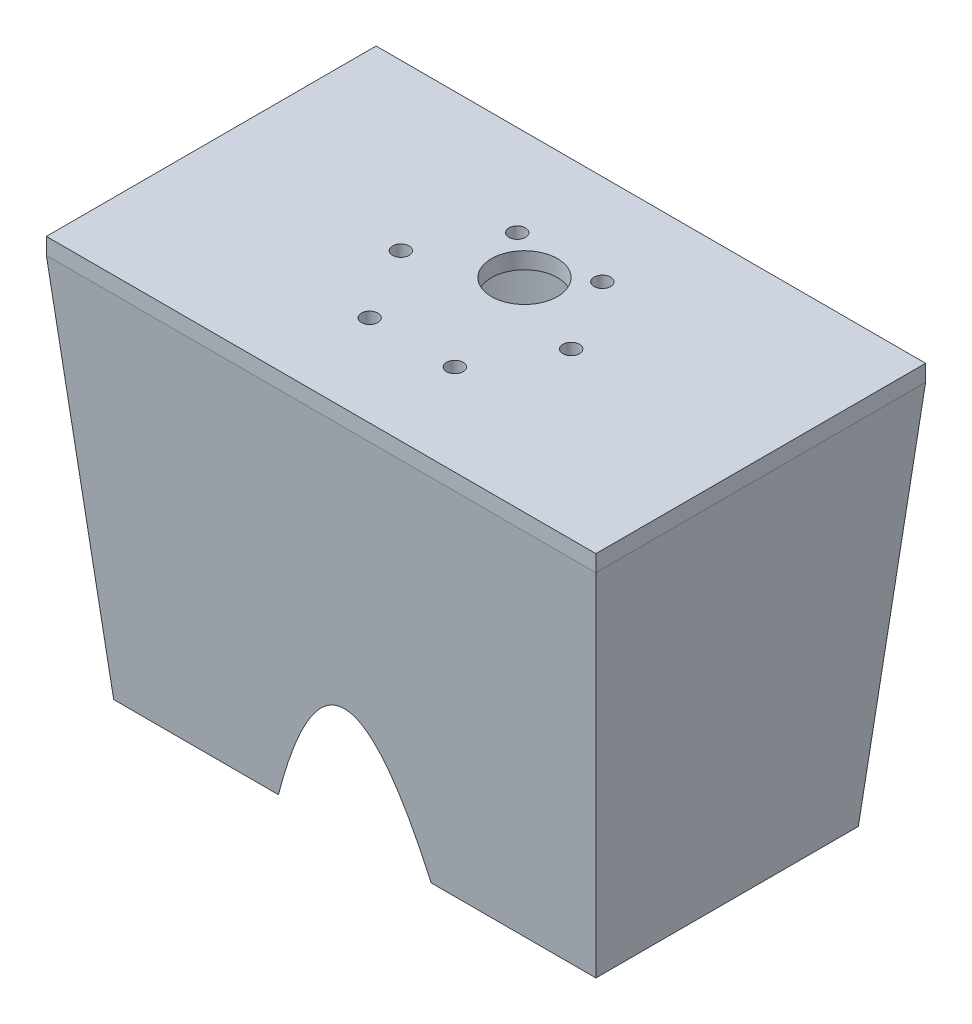
ISO-10303-21;
HEADER;
FILE_DESCRIPTION(('STEP AP214'),'2;1');
FILE_NAME('part.step','',(''),(''),'','','');
FILE_SCHEMA(('AUTOMOTIVE_DESIGN { 1 0 10303 214 1 1 1 1 }'));
ENDSEC;
DATA;
#1=APPLICATION_CONTEXT('core data for automotive mechanical design processes');
#2=APPLICATION_PROTOCOL_DEFINITION('international standard','automotive_design',2000,#1);
#3=PRODUCT_CONTEXT('',#1,'mechanical');
#4=PRODUCT('Part','Part','',(#3));
#5=PRODUCT_RELATED_PRODUCT_CATEGORY('part','',(#4));
#6=PRODUCT_DEFINITION_FORMATION('','',#4);
#7=PRODUCT_DEFINITION_CONTEXT('part definition',#1,'design');
#8=PRODUCT_DEFINITION('design','',#6,#7);
#9=PRODUCT_DEFINITION_SHAPE('','',#8);
#10=(LENGTH_UNIT() NAMED_UNIT(*) SI_UNIT(.MILLI.,.METRE.));
#11=(NAMED_UNIT(*) PLANE_ANGLE_UNIT() SI_UNIT($,.RADIAN.));
#12=(NAMED_UNIT(*) SI_UNIT($,.STERADIAN.) SOLID_ANGLE_UNIT());
#13=UNCERTAINTY_MEASURE_WITH_UNIT(LENGTH_MEASURE(1.E-05),#10,'distance_accuracy_value','');
#14=(GEOMETRIC_REPRESENTATION_CONTEXT(3) GLOBAL_UNCERTAINTY_ASSIGNED_CONTEXT((#13)) GLOBAL_UNIT_ASSIGNED_CONTEXT((#10,
#11,#12)) REPRESENTATION_CONTEXT('',''));
#15=CARTESIAN_POINT('',(0.,0.,0.));
#16=DIRECTION('',(0.,0.,1.));
#17=DIRECTION('',(1.,0.,0.));
#18=AXIS2_PLACEMENT_3D('',#15,#16,#17);
#19=CARTESIAN_POINT('',(0.,0.,0.));
#20=DIRECTION('',(0.,-1.,0.));
#21=DIRECTION('',(0.,0.,-1.));
#22=AXIS2_PLACEMENT_3D('',#19,#20,#21);
#23=PLANE('',#22);
#24=CARTESIAN_POINT('',(7.75000000000016,0.,-13.4233937586587));
#25=DIRECTION('',(0.,1.,0.));
#26=DIRECTION('',(0.,0.,1.));
#27=AXIS2_PLACEMENT_3D('',#24,#25,#26);
#28=CIRCLE('',#27,1.5);
#29=CARTESIAN_POINT('',(7.75000000000016,0.,-11.9233937586587));
#30=VERTEX_POINT('',#29);
#31=EDGE_CURVE('E179',#30,#30,#28,.T.);
#32=ORIENTED_EDGE('',*,*,#31,.T.);
#33=EDGE_LOOP('',(#32));
#34=FACE_BOUND('',#33,.T.);
#35=CARTESIAN_POINT('',(-15.5,0.,-1.08235921504137E-13));
#36=DIRECTION('',(0.,1.,0.));
#37=DIRECTION('',(0.,0.,1.));
#38=AXIS2_PLACEMENT_3D('',#35,#36,#37);
#39=CIRCLE('',#38,1.5);
#40=CARTESIAN_POINT('',(-15.5,0.,1.49999999999989));
#41=VERTEX_POINT('',#40);
#42=EDGE_CURVE('E167',#41,#41,#39,.T.);
#43=ORIENTED_EDGE('',*,*,#42,.T.);
#44=EDGE_LOOP('',(#43));
#45=FACE_BOUND('',#44,.T.);
#46=CARTESIAN_POINT('',(7.74999999999997,0.,13.4233937586588));
#47=DIRECTION('',(0.,1.,0.));
#48=DIRECTION('',(0.,0.,1.));
#49=AXIS2_PLACEMENT_3D('',#46,#47,#48);
#50=CIRCLE('',#49,1.5);
#51=CARTESIAN_POINT('',(7.74999999999997,0.,14.9233937586588));
#52=VERTEX_POINT('',#51);
#53=EDGE_CURVE('E155',#52,#52,#50,.T.);
#54=ORIENTED_EDGE('',*,*,#53,.T.);
#55=EDGE_LOOP('',(#54));
#56=FACE_BOUND('',#55,.T.);
#57=CARTESIAN_POINT('',(0.,0.,-7.));
#58=DIRECTION('',(0.,1.,0.));
#59=DIRECTION('',(0.,0.,1.));
#60=AXIS2_PLACEMENT_3D('',#57,#58,#59);
#61=CIRCLE('',#60,6.);
#62=CARTESIAN_POINT('',(0.,0.,-0.999999999999999));
#63=VERTEX_POINT('',#62);
#64=EDGE_CURVE('E143',#63,#63,#61,.T.);
#65=ORIENTED_EDGE('',*,*,#64,.T.);
#66=EDGE_LOOP('',(#65));
#67=FACE_BOUND('',#66,.T.);
#68=CARTESIAN_POINT('',(15.5,0.,0.));
#69=DIRECTION('',(0.,1.,0.));
#70=DIRECTION('',(0.,0.,1.));
#71=AXIS2_PLACEMENT_3D('',#68,#69,#70);
#72=CIRCLE('',#71,1.5);
#73=CARTESIAN_POINT('',(15.5,0.,1.5));
#74=VERTEX_POINT('',#73);
#75=EDGE_CURVE('E149',#74,#74,#72,.T.);
#76=ORIENTED_EDGE('',*,*,#75,.T.);
#77=EDGE_LOOP('',(#76));
#78=FACE_BOUND('',#77,.T.);
#79=CARTESIAN_POINT('',(-7.75000000000006,0.,13.4233937586588));
#80=DIRECTION('',(0.,1.,0.));
#81=DIRECTION('',(0.,0.,1.));
#82=AXIS2_PLACEMENT_3D('',#79,#80,#81);
#83=CIRCLE('',#82,1.5);
#84=CARTESIAN_POINT('',(-7.75000000000006,0.,14.9233937586588));
#85=VERTEX_POINT('',#84);
#86=EDGE_CURVE('E161',#85,#85,#83,.T.);
#87=ORIENTED_EDGE('',*,*,#86,.T.);
#88=EDGE_LOOP('',(#87));
#89=FACE_BOUND('',#88,.T.);
#90=CARTESIAN_POINT('',(-7.74999999999987,0.,-13.4233937586589));
#91=DIRECTION('',(0.,1.,0.));
#92=DIRECTION('',(0.,0.,1.));
#93=AXIS2_PLACEMENT_3D('',#90,#91,#92);
#94=CIRCLE('',#93,1.5);
#95=CARTESIAN_POINT('',(-7.74999999999987,0.,-11.9233937586589));
#96=VERTEX_POINT('',#95);
#97=EDGE_CURVE('E173',#96,#96,#94,.T.);
#98=ORIENTED_EDGE('',*,*,#97,.T.);
#99=EDGE_LOOP('',(#98));
#100=FACE_BOUND('',#99,.T.);
#101=CARTESIAN_POINT('',(0.,0.,0.));
#102=DIRECTION('',(0.,1.,0.));
#103=DIRECTION('',(0.,0.,1.));
#104=AXIS2_PLACEMENT_3D('',#101,#102,#103);
#105=CIRCLE('',#104,18.5);
#106=CARTESIAN_POINT('',(0.,0.,18.5));
#107=VERTEX_POINT('',#106);
#108=EDGE_CURVE('E188',#107,#107,#105,.T.);
#109=ORIENTED_EDGE('',*,*,#108,.F.);
#110=EDGE_LOOP('',(#109));
#111=FACE_BOUND('',#110,.T.);
#112=ADVANCED_FACE('F33',(#34,#45,#56,#67,#78,#89,#100,#111),#23,.T.);
#113=CARTESIAN_POINT('',(0.,3.,0.));
#114=DIRECTION('',(0.,-1.,0.));
#115=DIRECTION('',(0.,0.,-1.));
#116=AXIS2_PLACEMENT_3D('',#113,#114,#115);
#117=PLANE('',#116);
#118=DIRECTION('',(0.,0.,-1.));
#119=VECTOR('',#118,1.);
#120=CARTESIAN_POINT('',(50.,3.,30.));
#121=LINE('',#120,#119);
#122=CARTESIAN_POINT('',(50.,3.,30.));
#123=VERTEX_POINT('',#122);
#124=CARTESIAN_POINT('',(50.,3.,-30.));
#125=VERTEX_POINT('',#124);
#126=EDGE_CURVE('E106',#123,#125,#121,.T.);
#127=ORIENTED_EDGE('',*,*,#126,.T.);
#128=DIRECTION('',(-1.,0.,0.));
#129=VECTOR('',#128,1.);
#130=CARTESIAN_POINT('',(-50.,3.,-30.));
#131=LINE('',#130,#129);
#132=CARTESIAN_POINT('',(-50.,3.,-30.));
#133=VERTEX_POINT('',#132);
#134=EDGE_CURVE('E140',#125,#133,#131,.T.);
#135=ORIENTED_EDGE('',*,*,#134,.T.);
#136=DIRECTION('',(0.,0.,1.));
#137=VECTOR('',#136,1.);
#138=CARTESIAN_POINT('',(-50.,3.,30.));
#139=LINE('',#138,#137);
#140=CARTESIAN_POINT('',(-50.,3.,30.));
#141=VERTEX_POINT('',#140);
#142=EDGE_CURVE('E138',#133,#141,#139,.T.);
#143=ORIENTED_EDGE('',*,*,#142,.T.);
#144=DIRECTION('',(1.,0.,0.));
#145=VECTOR('',#144,1.);
#146=CARTESIAN_POINT('',(-50.,3.,30.));
#147=LINE('',#146,#145);
#148=EDGE_CURVE('E49',#141,#123,#147,.T.);
#149=ORIENTED_EDGE('',*,*,#148,.T.);
#150=EDGE_LOOP('',(#127,#135,#143,#149));
#151=FACE_BOUND('',#150,.T.);
#152=CARTESIAN_POINT('',(0.,3.,-7.));
#153=DIRECTION('',(0.,1.,0.));
#154=DIRECTION('',(0.,0.,1.));
#155=AXIS2_PLACEMENT_3D('',#152,#153,#154);
#156=CIRCLE('',#155,6.);
#157=CARTESIAN_POINT('',(0.,3.,-0.999999999999999));
#158=VERTEX_POINT('',#157);
#159=EDGE_CURVE('E136',#158,#158,#156,.T.);
#160=ORIENTED_EDGE('',*,*,#159,.F.);
#161=EDGE_LOOP('',(#160));
#162=FACE_BOUND('',#161,.T.);
#163=CARTESIAN_POINT('',(15.5,3.,0.));
#164=DIRECTION('',(0.,1.,0.));
#165=DIRECTION('',(0.,0.,1.));
#166=AXIS2_PLACEMENT_3D('',#163,#164,#165);
#167=CIRCLE('',#166,1.5);
#168=CARTESIAN_POINT('',(15.5,3.,1.5));
#169=VERTEX_POINT('',#168);
#170=EDGE_CURVE('E146',#169,#169,#167,.T.);
#171=ORIENTED_EDGE('',*,*,#170,.F.);
#172=EDGE_LOOP('',(#171));
#173=FACE_BOUND('',#172,.T.);
#174=CARTESIAN_POINT('',(7.74999999999997,3.,13.4233937586588));
#175=DIRECTION('',(0.,1.,0.));
#176=DIRECTION('',(0.,0.,1.));
#177=AXIS2_PLACEMENT_3D('',#174,#175,#176);
#178=CIRCLE('',#177,1.5);
#179=CARTESIAN_POINT('',(7.74999999999997,3.,14.9233937586588));
#180=VERTEX_POINT('',#179);
#181=EDGE_CURVE('E152',#180,#180,#178,.T.);
#182=ORIENTED_EDGE('',*,*,#181,.F.);
#183=EDGE_LOOP('',(#182));
#184=FACE_BOUND('',#183,.T.);
#185=CARTESIAN_POINT('',(-7.75000000000006,3.,13.4233937586588));
#186=DIRECTION('',(0.,1.,0.));
#187=DIRECTION('',(0.,0.,1.));
#188=AXIS2_PLACEMENT_3D('',#185,#186,#187);
#189=CIRCLE('',#188,1.5);
#190=CARTESIAN_POINT('',(-7.75000000000006,3.,14.9233937586588));
#191=VERTEX_POINT('',#190);
#192=EDGE_CURVE('E158',#191,#191,#189,.T.);
#193=ORIENTED_EDGE('',*,*,#192,.F.);
#194=EDGE_LOOP('',(#193));
#195=FACE_BOUND('',#194,.T.);
#196=CARTESIAN_POINT('',(-15.5,3.,-1.08235921504137E-13));
#197=DIRECTION('',(0.,1.,0.));
#198=DIRECTION('',(0.,0.,1.));
#199=AXIS2_PLACEMENT_3D('',#196,#197,#198);
#200=CIRCLE('',#199,1.5);
#201=CARTESIAN_POINT('',(-15.5,3.,1.49999999999989));
#202=VERTEX_POINT('',#201);
#203=EDGE_CURVE('E164',#202,#202,#200,.T.);
#204=ORIENTED_EDGE('',*,*,#203,.F.);
#205=EDGE_LOOP('',(#204));
#206=FACE_BOUND('',#205,.T.);
#207=CARTESIAN_POINT('',(-7.74999999999987,3.,-13.4233937586589));
#208=DIRECTION('',(0.,1.,0.));
#209=DIRECTION('',(0.,0.,1.));
#210=AXIS2_PLACEMENT_3D('',#207,#208,#209);
#211=CIRCLE('',#210,1.5);
#212=CARTESIAN_POINT('',(-7.74999999999987,3.,-11.9233937586589));
#213=VERTEX_POINT('',#212);
#214=EDGE_CURVE('E170',#213,#213,#211,.T.);
#215=ORIENTED_EDGE('',*,*,#214,.F.);
#216=EDGE_LOOP('',(#215));
#217=FACE_BOUND('',#216,.T.);
#218=CARTESIAN_POINT('',(7.75000000000016,3.,-13.4233937586587));
#219=DIRECTION('',(0.,1.,0.));
#220=DIRECTION('',(0.,0.,1.));
#221=AXIS2_PLACEMENT_3D('',#218,#219,#220);
#222=CIRCLE('',#221,1.5);
#223=CARTESIAN_POINT('',(7.75000000000016,3.,-11.9233937586587));
#224=VERTEX_POINT('',#223);
#225=EDGE_CURVE('E176',#224,#224,#222,.T.);
#226=ORIENTED_EDGE('',*,*,#225,.F.);
#227=EDGE_LOOP('',(#226));
#228=FACE_BOUND('',#227,.T.);
#229=ADVANCED_FACE('F260',(#151,#162,#173,#184,#195,#206,#217,#228),#117,.F.);
#230=CARTESIAN_POINT('',(50.,3.,30.));
#231=DIRECTION('',(-1.,0.,0.));
#232=DIRECTION('',(0.,0.,1.));
#233=AXIS2_PLACEMENT_3D('',#230,#231,#232);
#234=PLANE('',#233);
#235=DIRECTION('',(0.,0.,-1.));
#236=VECTOR('',#235,1.);
#237=CARTESIAN_POINT('',(50.,0.,30.));
#238=LINE('',#237,#236);
#239=CARTESIAN_POINT('',(50.,0.,30.));
#240=VERTEX_POINT('',#239);
#241=CARTESIAN_POINT('',(50.,0.,-30.));
#242=VERTEX_POINT('',#241);
#243=EDGE_CURVE('E133',#240,#242,#238,.T.);
#244=ORIENTED_EDGE('',*,*,#243,.T.);
#245=DIRECTION('',(0.,-1.,0.));
#246=VECTOR('',#245,1.);
#247=CARTESIAN_POINT('',(50.,3.,-30.));
#248=LINE('',#247,#246);
#249=EDGE_CURVE('E11',#125,#242,#248,.T.);
#250=ORIENTED_EDGE('',*,*,#249,.F.);
#251=ORIENTED_EDGE('',*,*,#126,.F.);
#252=DIRECTION('',(0.,-1.,0.));
#253=VECTOR('',#252,1.);
#254=CARTESIAN_POINT('',(50.,3.,30.));
#255=LINE('',#254,#253);
#256=EDGE_CURVE('E127',#123,#240,#255,.T.);
#257=ORIENTED_EDGE('',*,*,#256,.T.);
#258=EDGE_LOOP('',(#244,#250,#251,#257));
#259=FACE_BOUND('',#258,.T.);
#260=ADVANCED_FACE('F35',(#259),#234,.F.);
#261=CARTESIAN_POINT('',(-50.,3.,-30.));
#262=DIRECTION('',(0.,0.,1.));
#263=DIRECTION('',(1.,0.,0.));
#264=AXIS2_PLACEMENT_3D('',#261,#262,#263);
#265=PLANE('',#264);
#266=DIRECTION('',(-1.,0.,0.));
#267=VECTOR('',#266,1.);
#268=CARTESIAN_POINT('',(-50.,0.,-30.));
#269=LINE('',#268,#267);
#270=CARTESIAN_POINT('',(-50.,0.,-30.));
#271=VERTEX_POINT('',#270);
#272=EDGE_CURVE('E124',#242,#271,#269,.T.);
#273=ORIENTED_EDGE('',*,*,#272,.T.);
#274=DIRECTION('',(0.,-1.,0.));
#275=VECTOR('',#274,1.);
#276=CARTESIAN_POINT('',(-50.,3.,-30.));
#277=LINE('',#276,#275);
#278=EDGE_CURVE('E42',#133,#271,#277,.T.);
#279=ORIENTED_EDGE('',*,*,#278,.F.);
#280=ORIENTED_EDGE('',*,*,#134,.F.);
#281=ORIENTED_EDGE('',*,*,#249,.T.);
#282=EDGE_LOOP('',(#273,#279,#280,#281));
#283=FACE_BOUND('',#282,.T.);
#284=ADVANCED_FACE('F269',(#283),#265,.F.);
#285=CARTESIAN_POINT('',(-50.,3.,30.));
#286=DIRECTION('',(1.,0.,0.));
#287=DIRECTION('',(0.,0.,-1.));
#288=AXIS2_PLACEMENT_3D('',#285,#286,#287);
#289=PLANE('',#288);
#290=DIRECTION('',(0.,0.,1.));
#291=VECTOR('',#290,1.);
#292=CARTESIAN_POINT('',(-50.,0.,30.));
#293=LINE('',#292,#291);
#294=CARTESIAN_POINT('',(-50.,0.,30.));
#295=VERTEX_POINT('',#294);
#296=EDGE_CURVE('E107',#271,#295,#293,.T.);
#297=ORIENTED_EDGE('',*,*,#296,.T.);
#298=DIRECTION('',(0.,-1.,0.));
#299=VECTOR('',#298,1.);
#300=CARTESIAN_POINT('',(-50.,3.,30.));
#301=LINE('',#300,#299);
#302=EDGE_CURVE('E122',#141,#295,#301,.T.);
#303=ORIENTED_EDGE('',*,*,#302,.F.);
#304=ORIENTED_EDGE('',*,*,#142,.F.);
#305=ORIENTED_EDGE('',*,*,#278,.T.);
#306=EDGE_LOOP('',(#297,#303,#304,#305));
#307=FACE_BOUND('',#306,.T.);
#308=ADVANCED_FACE('F120',(#307),#289,.F.);
#309=CARTESIAN_POINT('',(-50.,3.,30.));
#310=DIRECTION('',(0.,0.,-1.));
#311=DIRECTION('',(-1.,0.,0.));
#312=AXIS2_PLACEMENT_3D('',#309,#310,#311);
#313=PLANE('',#312);
#314=DIRECTION('',(1.,0.,0.));
#315=VECTOR('',#314,1.);
#316=CARTESIAN_POINT('',(-50.,0.,30.));
#317=LINE('',#316,#315);
#318=EDGE_CURVE('E95',#295,#240,#317,.T.);
#319=ORIENTED_EDGE('',*,*,#318,.T.);
#320=ORIENTED_EDGE('',*,*,#256,.F.);
#321=ORIENTED_EDGE('',*,*,#148,.F.);
#322=ORIENTED_EDGE('',*,*,#302,.T.);
#323=EDGE_LOOP('',(#319,#320,#321,#322));
#324=FACE_BOUND('',#323,.T.);
#325=ADVANCED_FACE('F126',(#324),#313,.F.);
#326=CARTESIAN_POINT('',(0.,3.,-7.));
#327=DIRECTION('',(0.,-1.,0.));
#328=DIRECTION('',(0.,0.,-1.));
#329=AXIS2_PLACEMENT_3D('',#326,#327,#328);
#330=CYLINDRICAL_SURFACE('',#329,6.);
#331=ORIENTED_EDGE('',*,*,#159,.T.);
#332=EDGE_LOOP('',(#331));
#333=FACE_BOUND('',#332,.T.);
#334=ORIENTED_EDGE('',*,*,#64,.F.);
#335=EDGE_LOOP('',(#334));
#336=FACE_BOUND('',#335,.T.);
#337=ADVANCED_FACE('F255',(#333,#336),#330,.F.);
#338=CARTESIAN_POINT('',(15.5,3.,0.));
#339=DIRECTION('',(0.,-1.,0.));
#340=DIRECTION('',(0.,0.,-1.));
#341=AXIS2_PLACEMENT_3D('',#338,#339,#340);
#342=CYLINDRICAL_SURFACE('',#341,1.5);
#343=ORIENTED_EDGE('',*,*,#170,.T.);
#344=EDGE_LOOP('',(#343));
#345=FACE_BOUND('',#344,.T.);
#346=ORIENTED_EDGE('',*,*,#75,.F.);
#347=EDGE_LOOP('',(#346));
#348=FACE_BOUND('',#347,.T.);
#349=ADVANCED_FACE('F251',(#345,#348),#342,.F.);
#350=CARTESIAN_POINT('',(7.74999999999997,3.,13.4233937586588));
#351=DIRECTION('',(0.,-1.,0.));
#352=DIRECTION('',(0.,0.,-1.));
#353=AXIS2_PLACEMENT_3D('',#350,#351,#352);
#354=CYLINDRICAL_SURFACE('',#353,1.5);
#355=ORIENTED_EDGE('',*,*,#181,.T.);
#356=EDGE_LOOP('',(#355));
#357=FACE_BOUND('',#356,.T.);
#358=ORIENTED_EDGE('',*,*,#53,.F.);
#359=EDGE_LOOP('',(#358));
#360=FACE_BOUND('',#359,.T.);
#361=ADVANCED_FACE('F247',(#357,#360),#354,.F.);
#362=CARTESIAN_POINT('',(-7.75000000000006,3.,13.4233937586588));
#363=DIRECTION('',(0.,-1.,0.));
#364=DIRECTION('',(0.,0.,-1.));
#365=AXIS2_PLACEMENT_3D('',#362,#363,#364);
#366=CYLINDRICAL_SURFACE('',#365,1.5);
#367=ORIENTED_EDGE('',*,*,#192,.T.);
#368=EDGE_LOOP('',(#367));
#369=FACE_BOUND('',#368,.T.);
#370=ORIENTED_EDGE('',*,*,#86,.F.);
#371=EDGE_LOOP('',(#370));
#372=FACE_BOUND('',#371,.T.);
#373=ADVANCED_FACE('F243',(#369,#372),#366,.F.);
#374=CARTESIAN_POINT('',(-15.5,3.,-1.08235921504137E-13));
#375=DIRECTION('',(0.,-1.,0.));
#376=DIRECTION('',(0.,0.,-1.));
#377=AXIS2_PLACEMENT_3D('',#374,#375,#376);
#378=CYLINDRICAL_SURFACE('',#377,1.5);
#379=ORIENTED_EDGE('',*,*,#203,.T.);
#380=EDGE_LOOP('',(#379));
#381=FACE_BOUND('',#380,.T.);
#382=ORIENTED_EDGE('',*,*,#42,.F.);
#383=EDGE_LOOP('',(#382));
#384=FACE_BOUND('',#383,.T.);
#385=ADVANCED_FACE('F239',(#381,#384),#378,.F.);
#386=CARTESIAN_POINT('',(-7.74999999999987,3.,-13.4233937586589));
#387=DIRECTION('',(0.,-1.,0.));
#388=DIRECTION('',(0.,0.,-1.));
#389=AXIS2_PLACEMENT_3D('',#386,#387,#388);
#390=CYLINDRICAL_SURFACE('',#389,1.5);
#391=ORIENTED_EDGE('',*,*,#214,.T.);
#392=EDGE_LOOP('',(#391));
#393=FACE_BOUND('',#392,.T.);
#394=ORIENTED_EDGE('',*,*,#97,.F.);
#395=EDGE_LOOP('',(#394));
#396=FACE_BOUND('',#395,.T.);
#397=ADVANCED_FACE('F235',(#393,#396),#390,.F.);
#398=CARTESIAN_POINT('',(7.75000000000016,3.,-13.4233937586587));
#399=DIRECTION('',(0.,-1.,0.));
#400=DIRECTION('',(0.,0.,-1.));
#401=AXIS2_PLACEMENT_3D('',#398,#399,#400);
#402=CYLINDRICAL_SURFACE('',#401,1.5);
#403=ORIENTED_EDGE('',*,*,#225,.T.);
#404=EDGE_LOOP('',(#403));
#405=FACE_BOUND('',#404,.T.);
#406=ORIENTED_EDGE('',*,*,#31,.F.);
#407=EDGE_LOOP('',(#406));
#408=FACE_BOUND('',#407,.T.);
#409=ADVANCED_FACE('F231',(#405,#408),#402,.F.);
#410=CARTESIAN_POINT('',(0.,-20.,0.));
#411=DIRECTION('',(0.,1.,0.));
#412=DIRECTION('',(0.,0.,1.));
#413=AXIS2_PLACEMENT_3D('',#410,#411,#412);
#414=CYLINDRICAL_SURFACE('',#413,21.5);
#415=CARTESIAN_POINT('',(0.,-20.,0.));
#416=DIRECTION('',(0.,1.,0.));
#417=DIRECTION('',(0.,0.,1.));
#418=AXIS2_PLACEMENT_3D('',#415,#416,#417);
#419=CIRCLE('',#418,21.5);
#420=CARTESIAN_POINT('',(0.,-20.,21.5));
#421=VERTEX_POINT('',#420);
#422=EDGE_CURVE('E182',#421,#421,#419,.T.);
#423=ORIENTED_EDGE('',*,*,#422,.T.);
#424=EDGE_LOOP('',(#423));
#425=FACE_BOUND('',#424,.T.);
#426=CARTESIAN_POINT('',(0.,0.,0.));
#427=DIRECTION('',(0.,-1.,0.));
#428=DIRECTION('',(0.,0.,-1.));
#429=AXIS2_PLACEMENT_3D('',#426,#427,#428);
#430=CIRCLE('',#429,21.5);
#431=CARTESIAN_POINT('',(0.,0.,-21.5));
#432=VERTEX_POINT('',#431);
#433=EDGE_CURVE('E306',#432,#432,#430,.T.);
#434=ORIENTED_EDGE('',*,*,#433,.T.);
#435=EDGE_LOOP('',(#434));
#436=FACE_BOUND('',#435,.T.);
#437=ADVANCED_FACE('F227',(#425,#436),#414,.T.);
#438=CARTESIAN_POINT('',(0.,-20.,0.));
#439=DIRECTION('',(0.,1.,0.));
#440=DIRECTION('',(0.,0.,1.));
#441=AXIS2_PLACEMENT_3D('',#438,#439,#440);
#442=PLANE('',#441);
#443=CARTESIAN_POINT('',(0.,-20.,0.));
#444=DIRECTION('',(0.,1.,0.));
#445=DIRECTION('',(0.,0.,1.));
#446=AXIS2_PLACEMENT_3D('',#443,#444,#445);
#447=CIRCLE('',#446,18.5);
#448=CARTESIAN_POINT('',(0.,-20.,18.5));
#449=VERTEX_POINT('',#448);
#450=EDGE_CURVE('E187',#449,#449,#447,.T.);
#451=ORIENTED_EDGE('',*,*,#450,.T.);
#452=EDGE_LOOP('',(#451));
#453=FACE_BOUND('',#452,.T.);
#454=ORIENTED_EDGE('',*,*,#422,.F.);
#455=EDGE_LOOP('',(#454));
#456=FACE_BOUND('',#455,.T.);
#457=ADVANCED_FACE('F223',(#453,#456),#442,.F.);
#458=CARTESIAN_POINT('',(0.,-20.,0.));
#459=DIRECTION('',(0.,1.,0.));
#460=DIRECTION('',(0.,0.,1.));
#461=AXIS2_PLACEMENT_3D('',#458,#459,#460);
#462=CYLINDRICAL_SURFACE('',#461,18.5);
#463=ORIENTED_EDGE('',*,*,#450,.F.);
#464=EDGE_LOOP('',(#463));
#465=FACE_BOUND('',#464,.T.);
#466=ORIENTED_EDGE('',*,*,#108,.T.);
#467=EDGE_LOOP('',(#466));
#468=FACE_BOUND('',#467,.T.);
#469=ADVANCED_FACE('F218',(#465,#468),#462,.F.);
#470=CARTESIAN_POINT('',(0.,-70.,0.));
#471=DIRECTION('',(0.,1.,0.));
#472=DIRECTION('',(0.,0.,1.));
#473=AXIS2_PLACEMENT_3D('',#470,#471,#472);
#474=PLANE('',#473);
#475=DIRECTION('',(1.,0.,0.));
#476=VECTOR('',#475,1.);
#477=CARTESIAN_POINT('',(0.,-70.,23.8757935531853));
#478=LINE('',#477,#476);
#479=CARTESIAN_POINT('',(43.8757935531853,-70.,23.8757935531853));
#480=VERTEX_POINT('',#479);
#481=CARTESIAN_POINT('',(13.8940010084177,-70.,23.8757935531853));
#482=VERTEX_POINT('',#481);
#483=EDGE_CURVE('E301',#480,#482,#478,.F.);
#484=ORIENTED_EDGE('',*,*,#483,.T.);
#485=CARTESIAN_POINT('',(0.,-70.,0.));
#486=DIRECTION('',(0.,1.,0.));
#487=DIRECTION('',(0.,0.,1.));
#488=AXIS2_PLACEMENT_3D('',#485,#486,#487);
#489=CIRCLE('',#488,27.6242064468147);
#490=CARTESIAN_POINT('',(13.8940010084177,-70.,-23.8757935531853));
#491=VERTEX_POINT('',#490);
#492=EDGE_CURVE('E304',#491,#482,#489,.F.);
#493=ORIENTED_EDGE('',*,*,#492,.F.);
#494=DIRECTION('',(-1.,0.,0.));
#495=VECTOR('',#494,1.);
#496=CARTESIAN_POINT('',(0.,-70.,-23.8757935531853));
#497=LINE('',#496,#495);
#498=CARTESIAN_POINT('',(43.8757935531853,-70.,-23.8757935531853));
#499=VERTEX_POINT('',#498);
#500=EDGE_CURVE('E293',#491,#499,#497,.F.);
#501=ORIENTED_EDGE('',*,*,#500,.T.);
#502=DIRECTION('',(0.,0.,-1.));
#503=VECTOR('',#502,1.);
#504=CARTESIAN_POINT('',(43.8757935531853,-70.,0.));
#505=LINE('',#504,#503);
#506=EDGE_CURVE('E288',#499,#480,#505,.F.);
#507=ORIENTED_EDGE('',*,*,#506,.T.);
#508=EDGE_LOOP('',(#484,#493,#501,#507));
#509=FACE_BOUND('',#508,.T.);
#510=ADVANCED_FACE('F222',(#509),#474,.F.);
#511=CARTESIAN_POINT('',(-43.8757935531853,-70.,-23.8757935531853));
#512=VERTEX_POINT('',#511);
#513=CARTESIAN_POINT('',(-13.8940010084177,-70.,-23.8757935531853));
#514=VERTEX_POINT('',#513);
#515=EDGE_CURVE('E289',#512,#514,#497,.F.);
#516=ORIENTED_EDGE('',*,*,#515,.T.);
#517=CARTESIAN_POINT('',(-13.8940010084177,-70.,23.8757935531853));
#518=VERTEX_POINT('',#517);
#519=EDGE_CURVE('E300',#518,#514,#489,.F.);
#520=ORIENTED_EDGE('',*,*,#519,.F.);
#521=CARTESIAN_POINT('',(-43.8757935531853,-70.,23.8757935531853));
#522=VERTEX_POINT('',#521);
#523=EDGE_CURVE('E299',#518,#522,#478,.F.);
#524=ORIENTED_EDGE('',*,*,#523,.T.);
#525=DIRECTION('',(0.,0.,1.));
#526=VECTOR('',#525,1.);
#527=CARTESIAN_POINT('',(-43.8757935531853,-70.,0.));
#528=LINE('',#527,#526);
#529=EDGE_CURVE('E114',#522,#512,#528,.F.);
#530=ORIENTED_EDGE('',*,*,#529,.T.);
#531=EDGE_LOOP('',(#516,#520,#524,#530));
#532=FACE_BOUND('',#531,.T.);
#533=ADVANCED_FACE('F315',(#532),#474,.F.);
#534=CARTESIAN_POINT('',(50.,0.,-30.));
#535=DIRECTION('',(0.996194698091746,-0.0871557427476584,0.));
#536=DIRECTION('',(0.0871557427476584,0.996194698091746,0.));
#537=AXIS2_PLACEMENT_3D('',#534,#535,#536);
#538=PLANE('',#537);
#539=ORIENTED_EDGE('',*,*,#243,.F.);
#540=DIRECTION('',(0.0868265938642478,0.992432509138967,0.0868265938642478));
#541=VECTOR('',#540,1.);
#542=CARTESIAN_POINT('',(49.2461142597933,-8.61695344086855,29.2461142597933));
#543=LINE('',#542,#541);
#544=EDGE_CURVE('E102',#480,#240,#543,.T.);
#545=ORIENTED_EDGE('',*,*,#544,.F.);
#546=ORIENTED_EDGE('',*,*,#506,.F.);
#547=DIRECTION('',(0.0868265938642478,0.992432509138967,-0.0868265938642478));
#548=VECTOR('',#547,1.);
#549=CARTESIAN_POINT('',(50.,0.,-30.));
#550=LINE('',#549,#548);
#551=EDGE_CURVE('E281',#499,#242,#550,.T.);
#552=ORIENTED_EDGE('',*,*,#551,.T.);
#553=EDGE_LOOP('',(#539,#545,#546,#552));
#554=FACE_BOUND('',#553,.T.);
#555=ADVANCED_FACE('F286',(#554),#538,.T.);
#556=CARTESIAN_POINT('',(-50.,0.,30.));
#557=DIRECTION('',(0.,-0.0871557427476584,0.996194698091746));
#558=DIRECTION('',(0.,-0.996194698091746,-0.0871557427476584));
#559=AXIS2_PLACEMENT_3D('',#556,#557,#558);
#560=PLANE('',#559);
#561=ORIENTED_EDGE('',*,*,#523,.F.);
#562=CARTESIAN_POINT('',(25.2868463880573,-119.535553593206,19.5419941722989));
#563=CARTESIAN_POINT('',(25.1038482001875,-118.508545473163,19.6318457401518));
#564=CARTESIAN_POINT('',(24.9189319071204,-117.481877009481,19.7216675919235));
#565=CARTESIAN_POINT('',(24.544991022707,-115.429279285091,19.9012466235868));
#566=CARTESIAN_POINT('',(24.3559664168453,-114.403350027007,19.9910038032486));
#567=CARTESIAN_POINT('',(23.7823000895574,-111.326643789496,20.2601807200303));
#568=CARTESIAN_POINT('',(23.3910886300219,-109.277076540062,20.4394946194898));
#569=CARTESIAN_POINT('',(22.5875690749497,-105.177169291817,20.798190025219));
#570=CARTESIAN_POINT('',(22.1752147295109,-103.126838267154,20.9775707463525));
#571=CARTESIAN_POINT('',(21.3267946102712,-99.0311045236925,21.335901017726));
#572=CARTESIAN_POINT('',(20.8907295596289,-96.9857016565737,21.5148505809423));
#573=CARTESIAN_POINT('',(19.9776132419894,-92.8431229640435,21.8772792543028));
#574=CARTESIAN_POINT('',(19.4997504745026,-90.7461233769099,22.0607429455955));
#575=CARTESIAN_POINT('',(18.755455000059,-87.6070041144438,22.3353802945172));
#576=CARTESIAN_POINT('',(18.5027605818636,-86.5616459855812,22.4268372801173));
#577=CARTESIAN_POINT('',(17.9870761899798,-84.4734501714332,22.6095307410776));
#578=CARTESIAN_POINT('',(17.7240862488904,-83.4306124781783,22.7007672171349));
#579=CARTESIAN_POINT('',(17.1867453506044,-81.3489145550772,22.8828921862917));
#580=CARTESIAN_POINT('',(16.9124056114689,-80.3100514564775,22.9737809303746));
#581=CARTESIAN_POINT('',(16.3504905930463,-78.2358857632225,23.1552469148088));
#582=CARTESIAN_POINT('',(16.0629154515529,-77.2005831316199,23.2458241583926));
#583=CARTESIAN_POINT('',(15.4725146847584,-75.1344573114015,23.4265867450799));
#584=CARTESIAN_POINT('',(15.1696913024875,-74.1036334880422,23.5167721437163));
#585=CARTESIAN_POINT('',(14.5461443535299,-72.047389932365,23.6966701442863));
#586=CARTESIAN_POINT('',(14.2254215664083,-71.0219699668205,23.7863827666245));
#587=CARTESIAN_POINT('',(13.730538988602,-69.4959477590033,23.9198924100974));
#588=CARTESIAN_POINT('',(13.56447460429,-68.9927347726795,23.9639178417397));
#589=CARTESIAN_POINT('',(13.2266028652232,-67.9882208693419,24.0518014206359));
#590=CARTESIAN_POINT('',(13.0547955002469,-67.486919955733,24.0956595675919));
#591=CARTESIAN_POINT('',(12.7047961677739,-66.4864188887095,24.183192068802));
#592=CARTESIAN_POINT('',(12.5266029218325,-65.9872191785593,24.2268663842756));
#593=CARTESIAN_POINT('',(12.1631397017957,-64.9913809283823,24.3139909418716));
#594=CARTESIAN_POINT('',(11.977869758822,-64.4947423771029,24.3574411849785));
#595=CARTESIAN_POINT('',(11.6001994868977,-63.5066041992062,24.4438920735416));
#596=CARTESIAN_POINT('',(11.4078332813446,-63.0150916543786,24.4868938491948));
#597=CARTESIAN_POINT('',(11.0141893591687,-62.0356230155072,24.5725862513752));
#598=CARTESIAN_POINT('',(10.8129118168255,-61.5476668521283,24.6152768839685));
#599=CARTESIAN_POINT('',(10.4002190332284,-60.5761677066677,24.7002720458214));
#600=CARTESIAN_POINT('',(10.1888064580077,-60.0926236033948,24.7425766731726));
#601=CARTESIAN_POINT('',(9.75421940029682,-59.1308274098338,24.8267229367315));
#602=CARTESIAN_POINT('',(9.53104579456604,-58.6525749282738,24.8685646071712));
#603=CARTESIAN_POINT('',(9.13109938312377,-57.8269826981911,24.9407945679985));
#604=CARTESIAN_POINT('',(8.95746637345524,-57.4781344317543,24.9713148366024));
#605=CARTESIAN_POINT('',(8.60163669661426,-56.7847748791518,25.0319759372025));
#606=CARTESIAN_POINT('',(8.41943982860807,-56.4402636949368,25.0621167602792));
#607=CARTESIAN_POINT('',(8.04463177785624,-55.7554459073816,25.1220305532712));
#608=CARTESIAN_POINT('',(7.85198885361665,-55.4151564819419,25.1518020203149));
#609=CARTESIAN_POINT('',(7.45527223750199,-54.7412647045709,25.2107599112782));
#610=CARTESIAN_POINT('',(7.25119945678804,-54.4076618224749,25.2399463815812));
#611=CARTESIAN_POINT('',(6.81442368126779,-53.7251558481459,25.2996579171237));
#612=CARTESIAN_POINT('',(6.58071734665702,-53.3768856282699,25.3301276132066));
#613=CARTESIAN_POINT('',(6.09461978788842,-52.6931214771189,25.3899492249577));
#614=CARTESIAN_POINT('',(5.84221823018096,-52.3576347692677,25.4193005086583));
#615=CARTESIAN_POINT('',(5.31599618390796,-51.706097248994,25.476302655544));
#616=CARTESIAN_POINT('',(5.04227844775352,-51.389964899665,25.5039606522841));
#617=CARTESIAN_POINT('',(4.46765683981555,-50.7835428186965,25.5570157096807));
#618=CARTESIAN_POINT('',(4.16679348358348,-50.493215816737,25.5824160310676));
#619=CARTESIAN_POINT('',(3.60463922095119,-50.0129964229188,25.624429784032));
#620=CARTESIAN_POINT('',(3.35010744896949,-49.8153440397936,25.6417221268743));
#621=CARTESIAN_POINT('',(2.81863744945522,-49.4515204752246,25.6735525642977));
#622=CARTESIAN_POINT('',(2.54168743788762,-49.2853660058663,25.6880891967607));
#623=CARTESIAN_POINT('',(1.96093062089843,-48.9949709922649,25.7134954683953));
#624=CARTESIAN_POINT('',(1.65680265889169,-48.8713484537808,25.724311039069));
#625=CARTESIAN_POINT('',(1.03050409915998,-48.6847922941216,25.7406325881501));
#626=CARTESIAN_POINT('',(0.708388689940731,-48.6216827850024,25.7461539547587));
#627=CARTESIAN_POINT('',(0.0921323776175314,-48.5692551884472,25.7507407751132));
#628=CARTESIAN_POINT('',(-0.201396032534577,-48.5728870835671,25.7504230254631));
#629=CARTESIAN_POINT('',(-0.782423832088031,-48.6362621354382,25.744878426874));
#630=CARTESIAN_POINT('',(-1.06991507515408,-48.6960766805089,25.7396453322663));
#631=CARTESIAN_POINT('',(-1.67265558151932,-48.8766093175973,25.7238507731247));
#632=CARTESIAN_POINT('',(-1.98545818812332,-49.005219712501,25.712598821559));
#633=CARTESIAN_POINT('',(-2.58648548975664,-49.3100237964379,25.6859319196181));
#634=CARTESIAN_POINT('',(-2.87466909210552,-49.4862950722572,25.6705101812787));
#635=CARTESIAN_POINT('',(-3.39235458989721,-49.8483158633056,25.6388374661013));
#636=CARTESIAN_POINT('',(-3.62469184383122,-50.0301384859685,25.6229300478457));
#637=CARTESIAN_POINT('',(-4.07294624061976,-50.4130347831993,25.589430962532));
#638=CARTESIAN_POINT('',(-4.28884950693493,-50.6141244098574,25.5718378998467));
#639=CARTESIAN_POINT('',(-4.70673471888367,-51.0312519592308,25.5353439680322));
#640=CARTESIAN_POINT('',(-4.90867273022464,-51.2473331221174,25.5164393158781));
#641=CARTESIAN_POINT('',(-5.29979744924395,-51.690434163957,25.4776729979206));
#642=CARTESIAN_POINT('',(-5.48898873543222,-51.9174500644598,25.4578116801865));
#643=CARTESIAN_POINT('',(-5.96864310288518,-52.5212986799844,25.4049817718423));
#644=CARTESIAN_POINT('',(-6.25040970705638,-52.9049742012647,25.3714145132578));
#645=CARTESIAN_POINT('',(-6.79136433453972,-53.6879133543993,25.302916213128));
#646=CARTESIAN_POINT('',(-7.05053893265034,-54.0871860534835,25.2679843783027));
#647=CARTESIAN_POINT('',(-7.55082485561948,-54.8977980528868,25.1970650178368));
#648=CARTESIAN_POINT('',(-7.79190064575378,-55.3091589927112,25.1610755989848));
#649=CARTESIAN_POINT('',(-8.25863124282031,-56.1404855933557,25.0883439457409));
#650=CARTESIAN_POINT('',(-8.48428414547567,-56.5604523084472,25.0516016191122));
#651=CARTESIAN_POINT('',(-8.92500602303881,-57.4117828990795,24.977119843519));
#652=CARTESIAN_POINT('',(-9.13992857424432,-57.8432216881445,24.9393738404705));
#653=CARTESIAN_POINT('',(-9.55839928047512,-58.7115442718511,24.8634054581126));
#654=CARTESIAN_POINT('',(-9.76194689249547,-59.1484283252175,24.8251830561678));
#655=CARTESIAN_POINT('',(-10.1589154952106,-60.0259998486005,24.7484054964386));
#656=CARTESIAN_POINT('',(-10.3523500912009,-60.4666812283697,24.7098508714818));
#657=CARTESIAN_POINT('',(-10.7306104260226,-61.3516659682689,24.6324247393472));
#658=CARTESIAN_POINT('',(-10.9154364880711,-61.7959691916755,24.5935532441311));
#659=CARTESIAN_POINT('',(-11.3186681117314,-62.7890317428913,24.5066715287276));
#660=CARTESIAN_POINT('',(-11.535150308116,-63.3385655592282,24.458593549574));
#661=CARTESIAN_POINT('',(-11.9581666196962,-64.4414259315278,24.3621057695458));
#662=CARTESIAN_POINT('',(-12.164700398312,-64.9947526150901,24.3136959575077));
#663=CARTESIAN_POINT('',(-12.771294021976,-66.659608477058,24.1680399431808));
#664=CARTESIAN_POINT('',(-13.1582885137961,-67.7758694673286,24.0703797609959));
#665=CARTESIAN_POINT('',(-13.9048647719456,-70.0180866106453,23.8742111797922));
#666=CARTESIAN_POINT('',(-14.2644304137734,-71.1440480399843,23.7757023191576));
#667=CARTESIAN_POINT('',(-14.9609271123417,-73.4029192298756,23.5780766976768));
#668=CARTESIAN_POINT('',(-15.297857346103,-74.5358292414322,23.4789599148706));
#669=CARTESIAN_POINT('',(-15.9538746059894,-76.8108665294234,23.2799199430726));
#670=CARTESIAN_POINT('',(-16.272897833967,-77.9530119890461,23.179995163258));
#671=CARTESIAN_POINT('',(-16.8947073307122,-80.241687959926,22.9797619613218));
#672=CARTESIAN_POINT('',(-17.1974933422364,-81.3882185403478,22.8794535331491));
#673=CARTESIAN_POINT('',(-17.7889236794642,-83.6844512214745,22.6785592047328));
#674=CARTESIAN_POINT('',(-18.0775729933349,-84.8341520500732,22.577973415784));
#675=CARTESIAN_POINT('',(-18.6425843041992,-87.13653074806,22.3765413805666));
#676=CARTESIAN_POINT('',(-18.9189463768578,-88.2892085990692,22.2756951359059));
#677=CARTESIAN_POINT('',(-19.6722755120771,-91.4975942666191,21.9949977617762));
#678=CARTESIAN_POINT('',(-20.1374901265978,-93.5560436273071,21.8149067782738));
#679=CARTESIAN_POINT('',(-21.0398013721856,-97.6792367953047,21.4541741185465));
#680=CARTESIAN_POINT('',(-21.4768950366213,-99.7439812427303,21.2735323863187));
#681=CARTESIAN_POINT('',(-22.3245624509045,-103.864515812089,20.9130323238331));
#682=CARTESIAN_POINT('',(-22.7352935746007,-105.920273862384,20.7331767994802));
#683=CARTESIAN_POINT('',(-23.3363459827518,-109.006634890893,20.4631551979374));
#684=CARTESIAN_POINT('',(-23.5341745868941,-110.03579564763,20.3731152987772));
#685=CARTESIAN_POINT('',(-23.9251627562771,-112.09499193126,20.1929589679848));
#686=CARTESIAN_POINT('',(-24.1183223446652,-113.125027453791,20.1028425367344));
#687=CARTESIAN_POINT('',(-24.3093152852674,-114.155462307213,20.0126911685579));
#688=B_SPLINE_CURVE_WITH_KNOTS('',3,(#562,#563,#564,#565,#566,#567,#568,#569,#570,#571,#572,
#573,#574,#575,#576,#577,#578,#579,#580,#581,#582,#583,#584,#585,#586,#587,#588,#589,#590,#591,
#592,#593,#594,#595,#596,#597,#598,#599,#600,#601,#602,#603,#604,#605,#606,#607,#608,#609,#610,
#611,#612,#613,#614,#615,#616,#617,#618,#619,#620,#621,#622,#623,#624,#625,#626,#627,#628,#629,
#630,#631,#632,#633,#634,#635,#636,#637,#638,#639,#640,#641,#642,#643,#644,#645,#646,#647,#648,
#649,#650,#651,#652,#653,#654,#655,#656,#657,#658,#659,#660,#661,#662,#663,#664,#665,#666,#667,
#668,#669,#670,#671,#672,#673,#674,#675,#676,#677,#678,#679,#680,#681,#682,#683,#684,#685,#686,
#687),.UNSPECIFIED.,.F.,.F.,(4,2,2,2,2,2,2,2,2,2,2,2,2,2,2,2,2,2,2,2,2,2,2,2,2,2,2,2,2,2,2,2,2,
2,2,2,2,2,2,2,2,2,2,2,2,2,2,2,2,2,2,2,2,2,2,2,2,2,2,2,2,2,4),(0.,3.1411374813656,
6.28228606268587,12.5649752600136,18.8620486125071,25.1589300166674,31.6343344169353,
34.8723373528585,38.1103300370359,41.3451953907734,44.5800270739885,47.8143842927737,
51.0486007567255,52.6437690194437,54.2389401214518,55.8344323784219,57.4299176195724,
59.0185354901624,60.6071223057459,62.1952935103109,63.7833464871639,64.9558416568506,
66.1283643368229,67.3046747853613,68.4808915943118,69.741978601001,71.0037679355013,
72.2598123547154,73.5140121631558,74.4804436072502,75.4473863917383,76.4278382261387,
77.4054315497055,78.2804147057829,79.15651116283,80.166121447316,81.1773852683169,
82.0624702935625,82.9482945625488,83.8367895277837,84.7249636331319,86.1554322166597,
87.5867451360218,89.0207985016828,90.4550286124405,91.9052833659293,93.3556072911262,
94.8039270103961,96.2521923069642,98.0298461240881,99.807560041462,103.363454503222,
106.921423499535,110.47952178668,114.049582567658,117.619699891795,121.188548279184,
124.757374686515,131.111211184124,137.465716886925,143.777858971684,146.933438613539,
150.089002608011),.UNSPECIFIED.);
#689=EDGE_CURVE('E201',#518,#482,#688,.F.);
#690=ORIENTED_EDGE('',*,*,#689,.T.);
#691=ORIENTED_EDGE('',*,*,#483,.F.);
#692=ORIENTED_EDGE('',*,*,#544,.T.);
#693=ORIENTED_EDGE('',*,*,#318,.F.);
#694=DIRECTION('',(-0.0868265938642478,0.992432509138967,0.0868265938642478));
#695=VECTOR('',#694,1.);
#696=CARTESIAN_POINT('',(-49.547668555876,-5.17017206452113,29.547668555876));
#697=LINE('',#696,#695);
#698=EDGE_CURVE('E99',#522,#295,#697,.T.);
#699=ORIENTED_EDGE('',*,*,#698,.F.);
#700=EDGE_LOOP('',(#561,#690,#691,#692,#693,#699));
#701=FACE_BOUND('',#700,.T.);
#702=ADVANCED_FACE('F98',(#701),#560,.T.);
#703=CARTESIAN_POINT('',(-50.,0.,-30.));
#704=DIRECTION('',(-0.996194698091746,-0.0871557427476584,0.));
#705=DIRECTION('',(0.0871557427476584,-0.996194698091746,0.));
#706=AXIS2_PLACEMENT_3D('',#703,#704,#705);
#707=PLANE('',#706);
#708=ORIENTED_EDGE('',*,*,#296,.F.);
#709=DIRECTION('',(-0.0868265938642478,0.992432509138967,-0.0868265938642478));
#710=VECTOR('',#709,1.);
#711=CARTESIAN_POINT('',(-50.,0.,-30.));
#712=LINE('',#711,#710);
#713=EDGE_CURVE('E115',#512,#271,#712,.T.);
#714=ORIENTED_EDGE('',*,*,#713,.F.);
#715=ORIENTED_EDGE('',*,*,#529,.F.);
#716=ORIENTED_EDGE('',*,*,#698,.T.);
#717=EDGE_LOOP('',(#708,#714,#715,#716));
#718=FACE_BOUND('',#717,.T.);
#719=ADVANCED_FACE('F111',(#718),#707,.T.);
#720=CARTESIAN_POINT('',(-50.,0.,-30.));
#721=DIRECTION('',(0.,-0.0871557427476584,-0.996194698091746));
#722=DIRECTION('',(0.,0.996194698091746,-0.0871557427476584));
#723=AXIS2_PLACEMENT_3D('',#720,#721,#722);
#724=PLANE('',#723);
#725=ORIENTED_EDGE('',*,*,#500,.F.);
#726=CARTESIAN_POINT('',(-25.2868463880573,-119.535553593206,-19.5419941722989));
#727=CARTESIAN_POINT('',(-25.1038482001875,-118.508545473163,-19.6318457401518));
#728=CARTESIAN_POINT('',(-24.9189319071204,-117.481877009481,-19.7216675919235));
#729=CARTESIAN_POINT('',(-24.544991022707,-115.429279285091,-19.9012466235868));
#730=CARTESIAN_POINT('',(-24.3559664168453,-114.403350027007,-19.9910038032487));
#731=CARTESIAN_POINT('',(-23.7823000895574,-111.326643789496,-20.2601807200303));
#732=CARTESIAN_POINT('',(-23.3910886300219,-109.277076540062,-20.4394946194898));
#733=CARTESIAN_POINT('',(-22.5875690749497,-105.177169291817,-20.798190025219));
#734=CARTESIAN_POINT('',(-22.1752147295108,-103.126838267154,-20.9775707463526));
#735=CARTESIAN_POINT('',(-21.3267946102712,-99.0311045236925,-21.335901017726));
#736=CARTESIAN_POINT('',(-20.8907295596288,-96.9857016565737,-21.5148505809424));
#737=CARTESIAN_POINT('',(-19.9776132419894,-92.8431229640435,-21.8772792543028));
#738=CARTESIAN_POINT('',(-19.4997504745026,-90.7461233769099,-22.0607429455955));
#739=CARTESIAN_POINT('',(-18.755455000059,-87.6070041144437,-22.3353802945172));
#740=CARTESIAN_POINT('',(-18.5027605818636,-86.5616459855812,-22.4268372801173));
#741=CARTESIAN_POINT('',(-17.9870761899798,-84.4734501714331,-22.6095307410776));
#742=CARTESIAN_POINT('',(-17.7240862488903,-83.4306124781783,-22.7007672171349));
#743=CARTESIAN_POINT('',(-17.1867453506044,-81.3489145550772,-22.8828921862917));
#744=CARTESIAN_POINT('',(-16.9124056114689,-80.3100514564775,-22.9737809303746));
#745=CARTESIAN_POINT('',(-16.3504905930463,-78.2358857632225,-23.1552469148088));
#746=CARTESIAN_POINT('',(-16.0629154515529,-77.2005831316199,-23.2458241583926));
#747=CARTESIAN_POINT('',(-15.4725146847584,-75.1344573114015,-23.4265867450799));
#748=CARTESIAN_POINT('',(-15.1696913024875,-74.1036334880422,-23.5167721437163));
#749=CARTESIAN_POINT('',(-14.5461443535299,-72.047389932365,-23.6966701442863));
#750=CARTESIAN_POINT('',(-14.2254215664083,-71.0219699668205,-23.7863827666246));
#751=CARTESIAN_POINT('',(-13.730538988602,-69.4959477590033,-23.9198924100974));
#752=CARTESIAN_POINT('',(-13.56447460429,-68.9927347726795,-23.9639178417397));
#753=CARTESIAN_POINT('',(-13.2266028652232,-67.9882208693419,-24.0518014206359));
#754=CARTESIAN_POINT('',(-13.0547955002469,-67.486919955733,-24.0956595675919));
#755=CARTESIAN_POINT('',(-12.7047961677739,-66.4864188887095,-24.1831920688021));
#756=CARTESIAN_POINT('',(-12.5266029218325,-65.9872191785593,-24.2268663842756));
#757=CARTESIAN_POINT('',(-12.1631397017957,-64.9913809283823,-24.3139909418716));
#758=CARTESIAN_POINT('',(-11.977869758822,-64.4947423771029,-24.3574411849785));
#759=CARTESIAN_POINT('',(-11.6001994868977,-63.5066041992062,-24.4438920735416));
#760=CARTESIAN_POINT('',(-11.4078332813447,-63.0150916543786,-24.4868938491948));
#761=CARTESIAN_POINT('',(-11.0141893591687,-62.0356230155072,-24.5725862513752));
#762=CARTESIAN_POINT('',(-10.8129118168255,-61.5476668521283,-24.6152768839685));
#763=CARTESIAN_POINT('',(-10.4002190332284,-60.5761677066677,-24.7002720458214));
#764=CARTESIAN_POINT('',(-10.1888064580077,-60.0926236033948,-24.7425766731726));
#765=CARTESIAN_POINT('',(-9.75421940029682,-59.1308274098338,-24.8267229367316));
#766=CARTESIAN_POINT('',(-9.53104579456604,-58.6525749282738,-24.8685646071712));
#767=CARTESIAN_POINT('',(-9.13109938312377,-57.8269826981911,-24.9407945679985));
#768=CARTESIAN_POINT('',(-8.95746637345525,-57.4781344317543,-24.9713148366024));
#769=CARTESIAN_POINT('',(-8.60163669661428,-56.7847748791518,-25.0319759372025));
#770=CARTESIAN_POINT('',(-8.41943982860809,-56.4402636949368,-25.0621167602792));
#771=CARTESIAN_POINT('',(-8.04463177785625,-55.7554459073816,-25.1220305532712));
#772=CARTESIAN_POINT('',(-7.85198885361665,-55.4151564819419,-25.1518020203149));
#773=CARTESIAN_POINT('',(-7.45527223750199,-54.7412647045709,-25.2107599112782));
#774=CARTESIAN_POINT('',(-7.25119945678805,-54.4076618224748,-25.2399463815812));
#775=CARTESIAN_POINT('',(-6.81442368126779,-53.7251558481458,-25.2996579171237));
#776=CARTESIAN_POINT('',(-6.58071734665701,-53.3768856282699,-25.3301276132066));
#777=CARTESIAN_POINT('',(-6.0946197878884,-52.6931214771188,-25.3899492249577));
#778=CARTESIAN_POINT('',(-5.84221823018095,-52.3576347692676,-25.4193005086583));
#779=CARTESIAN_POINT('',(-5.31599618390795,-51.706097248994,-25.4763026555441));
#780=CARTESIAN_POINT('',(-5.04227844775352,-51.389964899665,-25.5039606522842));
#781=CARTESIAN_POINT('',(-4.46765683981555,-50.7835428186964,-25.5570157096807));
#782=CARTESIAN_POINT('',(-4.16679348358347,-50.4932158167369,-25.5824160310676));
#783=CARTESIAN_POINT('',(-3.60463922095116,-50.0129964229187,-25.624429784032));
#784=CARTESIAN_POINT('',(-3.35010744896946,-49.8153440397936,-25.6417221268743));
#785=CARTESIAN_POINT('',(-2.8186374494552,-49.4515204752245,-25.6735525642977));
#786=CARTESIAN_POINT('',(-2.54168743788761,-49.2853660058663,-25.6880891967607));
#787=CARTESIAN_POINT('',(-1.96093062089842,-48.9949709922648,-25.7134954683953));
#788=CARTESIAN_POINT('',(-1.65680265889168,-48.8713484537807,-25.724311039069));
#789=CARTESIAN_POINT('',(-1.03050409915997,-48.6847922941216,-25.7406325881501));
#790=CARTESIAN_POINT('',(-0.708388689940715,-48.6216827850023,-25.7461539547587));
#791=CARTESIAN_POINT('',(-0.0921323776175191,-48.5692551884471,-25.7507407751132));
#792=CARTESIAN_POINT('',(0.201396032534588,-48.5728870835671,-25.7504230254631));
#793=CARTESIAN_POINT('',(0.782423832088041,-48.6362621354381,-25.744878426874));
#794=CARTESIAN_POINT('',(1.06991507515409,-48.6960766805089,-25.7396453322664));
#795=CARTESIAN_POINT('',(1.67265558151933,-48.8766093175973,-25.7238507731247));
#796=CARTESIAN_POINT('',(1.98545818812333,-49.005219712501,-25.712598821559));
#797=CARTESIAN_POINT('',(2.58648548975664,-49.3100237964378,-25.6859319196181));
#798=CARTESIAN_POINT('',(2.87466909210554,-49.4862950722572,-25.6705101812787));
#799=CARTESIAN_POINT('',(3.39235458989722,-49.8483158633055,-25.6388374661013));
#800=CARTESIAN_POINT('',(3.62469184383122,-50.0301384859685,-25.6229300478457));
#801=CARTESIAN_POINT('',(4.07294624061974,-50.4130347831992,-25.589430962532));
#802=CARTESIAN_POINT('',(4.28884950693492,-50.6141244098574,-25.5718378998467));
#803=CARTESIAN_POINT('',(4.70673471888367,-51.0312519592307,-25.5353439680322));
#804=CARTESIAN_POINT('',(4.90867273022465,-51.2473331221174,-25.5164393158781));
#805=CARTESIAN_POINT('',(5.29979744924396,-51.6904341639569,-25.4776729979206));
#806=CARTESIAN_POINT('',(5.48898873543222,-51.9174500644598,-25.4578116801865));
#807=CARTESIAN_POINT('',(5.96864310288519,-52.5212986799843,-25.4049817718423));
#808=CARTESIAN_POINT('',(6.25040970705639,-52.9049742012647,-25.3714145132579));
#809=CARTESIAN_POINT('',(6.79136433453974,-53.6879133543992,-25.302916213128));
#810=CARTESIAN_POINT('',(7.05053893265037,-54.0871860534835,-25.2679843783027));
#811=CARTESIAN_POINT('',(7.5508248556195,-54.8977980528868,-25.1970650178369));
#812=CARTESIAN_POINT('',(7.7919006457538,-55.3091589927111,-25.1610755989849));
#813=CARTESIAN_POINT('',(8.25863124282034,-56.1404855933557,-25.0883439457409));
#814=CARTESIAN_POINT('',(8.4842841454757,-56.5604523084471,-25.0516016191122));
#815=CARTESIAN_POINT('',(8.92500602303884,-57.4117828990794,-24.977119843519));
#816=CARTESIAN_POINT('',(9.13992857424434,-57.8432216881445,-24.9393738404705));
#817=CARTESIAN_POINT('',(9.55839928047514,-58.7115442718511,-24.8634054581126));
#818=CARTESIAN_POINT('',(9.76194689249551,-59.1484283252174,-24.8251830561678));
#819=CARTESIAN_POINT('',(10.1589154952106,-60.0259998486004,-24.7484054964386));
#820=CARTESIAN_POINT('',(10.3523500912009,-60.4666812283697,-24.7098508714819));
#821=CARTESIAN_POINT('',(10.7306104260226,-61.3516659682689,-24.6324247393472));
#822=CARTESIAN_POINT('',(10.9154364880711,-61.7959691916755,-24.5935532441311));
#823=CARTESIAN_POINT('',(11.3186681117314,-62.7890317428912,-24.5066715287276));
#824=CARTESIAN_POINT('',(11.5351503081161,-63.3385655592281,-24.458593549574));
#825=CARTESIAN_POINT('',(11.9581666196962,-64.4414259315277,-24.3621057695458));
#826=CARTESIAN_POINT('',(12.164700398312,-64.9947526150901,-24.3136959575077));
#827=CARTESIAN_POINT('',(12.771294021976,-66.6596084770579,-24.1680399431808));
#828=CARTESIAN_POINT('',(13.1582885137961,-67.7758694673285,-24.0703797609959));
#829=CARTESIAN_POINT('',(13.9048647719455,-70.0180866106451,-23.8742111797923));
#830=CARTESIAN_POINT('',(14.2644304137734,-71.1440480399842,-23.7757023191576));
#831=CARTESIAN_POINT('',(14.9609271123416,-73.4029192298754,-23.5780766976768));
#832=CARTESIAN_POINT('',(15.297857346103,-74.535829241432,-23.4789599148706));
#833=CARTESIAN_POINT('',(15.9538746059894,-76.8108665294232,-23.2799199430726));
#834=CARTESIAN_POINT('',(16.272897833967,-77.9530119890459,-23.179995163258));
#835=CARTESIAN_POINT('',(16.8947073307122,-80.2416879599258,-22.9797619613219));
#836=CARTESIAN_POINT('',(17.1974933422364,-81.3882185403475,-22.8794535331492));
#837=CARTESIAN_POINT('',(17.7889236794641,-83.6844512214742,-22.6785592047328));
#838=CARTESIAN_POINT('',(18.0775729933348,-84.8341520500729,-22.5779734157841));
#839=CARTESIAN_POINT('',(18.6425843041991,-87.1365307480596,-22.3765413805667));
#840=CARTESIAN_POINT('',(18.9189463768577,-88.2892085990688,-22.2756951359059));
#841=CARTESIAN_POINT('',(19.672275512077,-91.4975942666187,-21.9949977617763));
#842=CARTESIAN_POINT('',(20.1374901265978,-93.5560436273067,-21.8149067782739));
#843=CARTESIAN_POINT('',(21.0398013721856,-97.6792367953044,-21.4541741185465));
#844=CARTESIAN_POINT('',(21.4768950366213,-99.74398124273,-21.2735323863187));
#845=CARTESIAN_POINT('',(22.3245624509045,-103.864515812088,-20.9130323238332));
#846=CARTESIAN_POINT('',(22.7352935746007,-105.920273862383,-20.7331767994802));
#847=CARTESIAN_POINT('',(23.3363459827518,-109.006634890893,-20.4631551979374));
#848=CARTESIAN_POINT('',(23.534174586894,-110.035795647629,-20.3731152987772));
#849=CARTESIAN_POINT('',(23.9251627562771,-112.09499193126,-20.1929589679848));
#850=CARTESIAN_POINT('',(24.1183223446652,-113.125027453791,-20.1028425367344));
#851=CARTESIAN_POINT('',(24.3093152852673,-114.155462307213,-20.0126911685579));
#852=B_SPLINE_CURVE_WITH_KNOTS('',3,(#726,#727,#728,#729,#730,#731,#732,#733,#734,#735,#736,
#737,#738,#739,#740,#741,#742,#743,#744,#745,#746,#747,#748,#749,#750,#751,#752,#753,#754,#755,
#756,#757,#758,#759,#760,#761,#762,#763,#764,#765,#766,#767,#768,#769,#770,#771,#772,#773,#774,
#775,#776,#777,#778,#779,#780,#781,#782,#783,#784,#785,#786,#787,#788,#789,#790,#791,#792,#793,
#794,#795,#796,#797,#798,#799,#800,#801,#802,#803,#804,#805,#806,#807,#808,#809,#810,#811,#812,
#813,#814,#815,#816,#817,#818,#819,#820,#821,#822,#823,#824,#825,#826,#827,#828,#829,#830,#831,
#832,#833,#834,#835,#836,#837,#838,#839,#840,#841,#842,#843,#844,#845,#846,#847,#848,#849,#850,
#851),.UNSPECIFIED.,.F.,.F.,(4,2,2,2,2,2,2,2,2,2,2,2,2,2,2,2,2,2,2,2,2,2,2,2,2,2,2,2,2,2,2,2,2,
2,2,2,2,2,2,2,2,2,2,2,2,2,2,2,2,2,2,2,2,2,2,2,2,2,2,2,2,2,4),(0.,3.1411374813656,
6.2822860626859,12.5649752600136,18.8620486125071,25.1589300166675,31.6343344169353,
34.8723373528586,38.110330037036,41.3451953907735,44.5800270739885,47.8143842927737,
51.0486007567255,52.6437690194437,54.2389401214518,55.8344323784218,57.4299176195724,
59.0185354901623,60.6071223057459,62.1952935103109,63.7833464871639,64.9558416568506,
66.1283643368229,67.3046747853613,68.4808915943118,69.741978601001,71.0037679355014,
72.2598123547155,73.5140121631559,74.4804436072503,75.4473863917383,76.4278382261387,
77.4054315497056,78.2804147057829,79.15651116283,80.166121447316,81.177385268317,
82.0624702935625,82.9482945625488,83.8367895277837,84.7249636331319,86.1554322166598,
87.5867451360219,89.0207985016828,90.4550286124405,91.9052833659294,93.3556072911262,
94.8039270103961,96.2521923069642,98.0298461240882,99.8075600414621,103.363454503222,
106.921423499535,110.47952178668,114.049582567658,117.619699891794,121.188548279184,
124.757374686515,131.111211184124,137.465716886925,143.777858971684,146.933438613539,
150.089002608011),.UNSPECIFIED.);
#853=EDGE_CURVE('E191',#491,#514,#852,.F.);
#854=ORIENTED_EDGE('',*,*,#853,.T.);
#855=ORIENTED_EDGE('',*,*,#515,.F.);
#856=ORIENTED_EDGE('',*,*,#713,.T.);
#857=ORIENTED_EDGE('',*,*,#272,.F.);
#858=ORIENTED_EDGE('',*,*,#551,.F.);
#859=EDGE_LOOP('',(#725,#854,#855,#856,#857,#858));
#860=FACE_BOUND('',#859,.T.);
#861=ADVANCED_FACE('F208',(#860),#724,.T.);
#862=CARTESIAN_POINT('',(0.,0.,0.));
#863=DIRECTION('',(0.,-1.,0.));
#864=DIRECTION('',(0.,0.,-1.));
#865=AXIS2_PLACEMENT_3D('',#862,#863,#864);
#866=CONICAL_SURFACE('',#865,21.5,0.0872664625997167);
#867=ORIENTED_EDGE('',*,*,#853,.F.);
#868=ORIENTED_EDGE('',*,*,#492,.T.);
#869=ORIENTED_EDGE('',*,*,#689,.F.);
#870=ORIENTED_EDGE('',*,*,#519,.T.);
#871=EDGE_LOOP('',(#867,#868,#869,#870));
#872=FACE_BOUND('',#871,.T.);
#873=ORIENTED_EDGE('',*,*,#433,.F.);
#874=EDGE_LOOP('',(#873));
#875=FACE_BOUND('',#874,.T.);
#876=ADVANCED_FACE('F212',(#872,#875),#866,.F.);
#877=CLOSED_SHELL('',(#112,#229,#260,#284,#308,#325,#337,#349,#361,#373,#385,#397,#409,#437,
#457,#469,#510,#533,#555,#702,#719,#861,#876));
#878=MANIFOLD_SOLID_BREP('B2',#877);
#879=ADVANCED_BREP_SHAPE_REPRESENTATION('',(#18,#878),#14);
#880=SHAPE_DEFINITION_REPRESENTATION(#9,#879);
ENDSEC;
END-ISO-10303-21;
